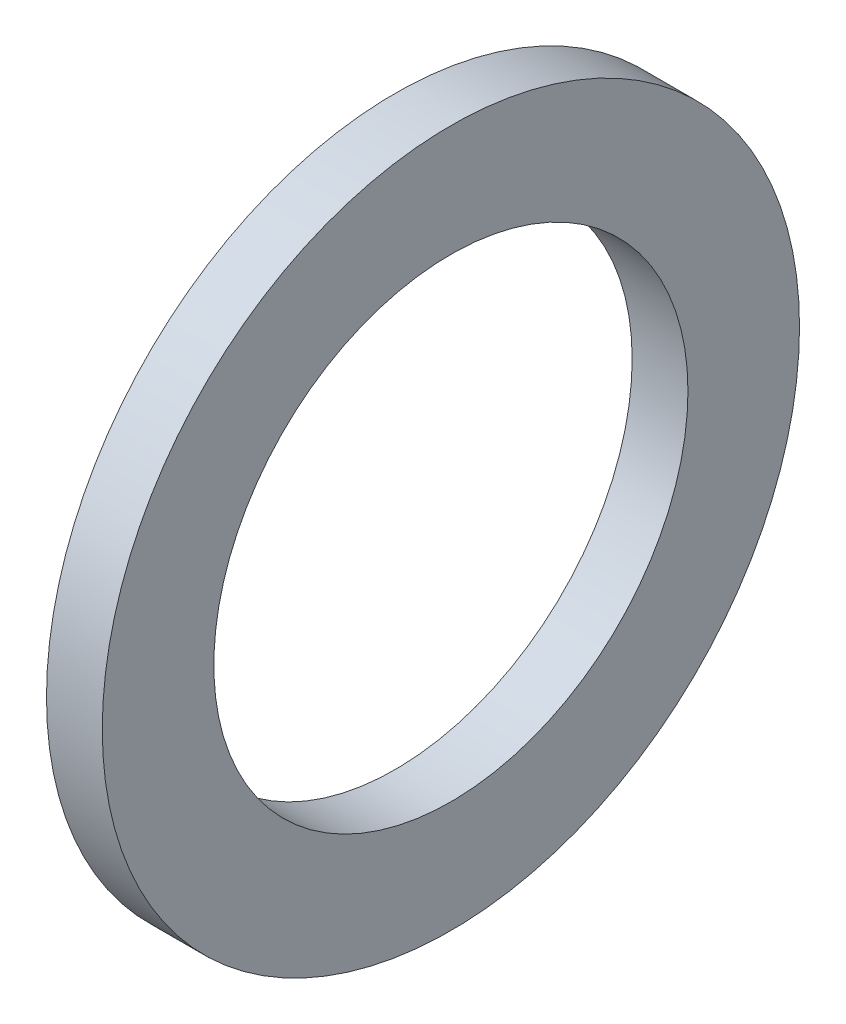
ISO-10303-21;
HEADER;
FILE_DESCRIPTION(('STEP AP214'),'2;1');
FILE_NAME('part.step','',(''),(''),'','','');
FILE_SCHEMA(('AUTOMOTIVE_DESIGN { 1 0 10303 214 1 1 1 1 }'));
ENDSEC;
DATA;
#1=APPLICATION_CONTEXT('core data for automotive mechanical design processes');
#2=APPLICATION_PROTOCOL_DEFINITION('international standard','automotive_design',2000,#1);
#3=PRODUCT_CONTEXT('',#1,'mechanical');
#4=PRODUCT('Part','Part','',(#3));
#5=PRODUCT_RELATED_PRODUCT_CATEGORY('part','',(#4));
#6=PRODUCT_DEFINITION_FORMATION('','',#4);
#7=PRODUCT_DEFINITION_CONTEXT('part definition',#1,'design');
#8=PRODUCT_DEFINITION('design','',#6,#7);
#9=PRODUCT_DEFINITION_SHAPE('','',#8);
#10=(LENGTH_UNIT() NAMED_UNIT(*) SI_UNIT(.MILLI.,.METRE.));
#11=(NAMED_UNIT(*) PLANE_ANGLE_UNIT() SI_UNIT($,.RADIAN.));
#12=(NAMED_UNIT(*) SI_UNIT($,.STERADIAN.) SOLID_ANGLE_UNIT());
#13=UNCERTAINTY_MEASURE_WITH_UNIT(LENGTH_MEASURE(1.E-05),#10,'distance_accuracy_value','');
#14=(GEOMETRIC_REPRESENTATION_CONTEXT(3) GLOBAL_UNCERTAINTY_ASSIGNED_CONTEXT((#13)) GLOBAL_UNIT_ASSIGNED_CONTEXT((#10,
#11,#12)) REPRESENTATION_CONTEXT('',''));
#15=CARTESIAN_POINT('',(0.,0.,0.));
#16=DIRECTION('',(0.,0.,1.));
#17=DIRECTION('',(1.,0.,0.));
#18=AXIS2_PLACEMENT_3D('',#15,#16,#17);
#19=CARTESIAN_POINT('',(0.,0.,0.));
#20=DIRECTION('',(1.,0.,0.));
#21=DIRECTION('',(0.,0.,-1.));
#22=AXIS2_PLACEMENT_3D('',#19,#20,#21);
#23=CYLINDRICAL_SURFACE('',#22,8.5);
#24=CARTESIAN_POINT('',(2.,0.,0.));
#25=DIRECTION('',(1.,0.,0.));
#26=DIRECTION('',(0.,0.,-1.));
#27=AXIS2_PLACEMENT_3D('',#24,#25,#26);
#28=CIRCLE('',#27,8.5);
#29=CARTESIAN_POINT('',(2.,0.,-8.5));
#30=VERTEX_POINT('',#29);
#31=EDGE_CURVE('E58',#30,#30,#28,.T.);
#32=ORIENTED_EDGE('',*,*,#31,.T.);
#33=EDGE_LOOP('',(#32));
#34=FACE_BOUND('',#33,.T.);
#35=CARTESIAN_POINT('',(0.,0.,0.));
#36=DIRECTION('',(1.,0.,0.));
#37=DIRECTION('',(0.,0.,-1.));
#38=AXIS2_PLACEMENT_3D('',#35,#36,#37);
#39=CIRCLE('',#38,8.5);
#40=CARTESIAN_POINT('',(0.,0.,-8.5));
#41=VERTEX_POINT('',#40);
#42=EDGE_CURVE('E10',#41,#41,#39,.T.);
#43=ORIENTED_EDGE('',*,*,#42,.F.);
#44=EDGE_LOOP('',(#43));
#45=FACE_BOUND('',#44,.T.);
#46=ADVANCED_FACE('F41',(#34,#45),#23,.F.);
#47=CARTESIAN_POINT('',(0.,8.5,0.));
#48=DIRECTION('',(-1.,0.,0.));
#49=DIRECTION('',(0.,0.,1.));
#50=AXIS2_PLACEMENT_3D('',#47,#48,#49);
#51=PLANE('',#50);
#52=ORIENTED_EDGE('',*,*,#42,.T.);
#53=EDGE_LOOP('',(#52));
#54=FACE_BOUND('',#53,.T.);
#55=CARTESIAN_POINT('',(0.,0.,0.));
#56=DIRECTION('',(1.,0.,0.));
#57=DIRECTION('',(0.,0.,-1.));
#58=AXIS2_PLACEMENT_3D('',#55,#56,#57);
#59=CIRCLE('',#58,12.5);
#60=CARTESIAN_POINT('',(0.,0.,-12.5));
#61=VERTEX_POINT('',#60);
#62=EDGE_CURVE('E48',#61,#61,#59,.T.);
#63=ORIENTED_EDGE('',*,*,#62,.F.);
#64=EDGE_LOOP('',(#63));
#65=FACE_BOUND('',#64,.T.);
#66=ADVANCED_FACE('F75',(#54,#65),#51,.T.);
#67=CARTESIAN_POINT('',(0.,0.,0.));
#68=DIRECTION('',(1.,0.,0.));
#69=DIRECTION('',(0.,0.,-1.));
#70=AXIS2_PLACEMENT_3D('',#67,#68,#69);
#71=CYLINDRICAL_SURFACE('',#70,12.5);
#72=ORIENTED_EDGE('',*,*,#62,.T.);
#73=EDGE_LOOP('',(#72));
#74=FACE_BOUND('',#73,.T.);
#75=CARTESIAN_POINT('',(2.,0.,0.));
#76=DIRECTION('',(1.,0.,0.));
#77=DIRECTION('',(0.,0.,-1.));
#78=AXIS2_PLACEMENT_3D('',#75,#76,#77);
#79=CIRCLE('',#78,12.5);
#80=CARTESIAN_POINT('',(2.,0.,-12.5));
#81=VERTEX_POINT('',#80);
#82=EDGE_CURVE('E53',#81,#81,#79,.T.);
#83=ORIENTED_EDGE('',*,*,#82,.F.);
#84=EDGE_LOOP('',(#83));
#85=FACE_BOUND('',#84,.T.);
#86=ADVANCED_FACE('F69',(#74,#85),#71,.T.);
#87=CARTESIAN_POINT('',(2.,12.5,0.));
#88=DIRECTION('',(1.,0.,0.));
#89=DIRECTION('',(0.,0.,-1.));
#90=AXIS2_PLACEMENT_3D('',#87,#88,#89);
#91=PLANE('',#90);
#92=ORIENTED_EDGE('',*,*,#82,.T.);
#93=EDGE_LOOP('',(#92));
#94=FACE_BOUND('',#93,.T.);
#95=ORIENTED_EDGE('',*,*,#31,.F.);
#96=EDGE_LOOP('',(#95));
#97=FACE_BOUND('',#96,.T.);
#98=ADVANCED_FACE('F67',(#94,#97),#91,.T.);
#99=CLOSED_SHELL('',(#46,#66,#86,#98));
#100=MANIFOLD_SOLID_BREP('B2',#99);
#101=ADVANCED_BREP_SHAPE_REPRESENTATION('',(#18,#100),#14);
#102=SHAPE_DEFINITION_REPRESENTATION(#9,#101);
ENDSEC;
END-ISO-10303-21;
